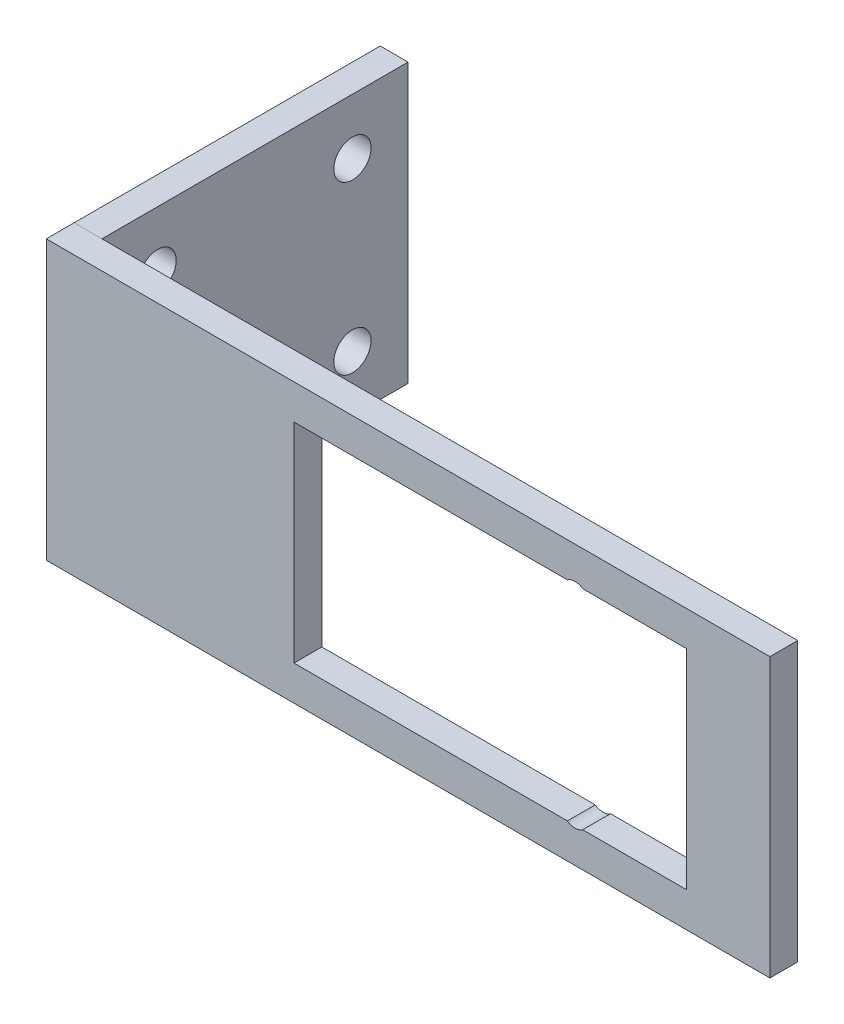
ISO-10303-21;
HEADER;
FILE_DESCRIPTION(('STEP AP214'),'2;1');
FILE_NAME('part.step','',(''),(''),'','','');
FILE_SCHEMA(('AUTOMOTIVE_DESIGN { 1 0 10303 214 1 1 1 1 }'));
ENDSEC;
DATA;
#1=APPLICATION_CONTEXT('core data for automotive mechanical design processes');
#2=APPLICATION_PROTOCOL_DEFINITION('international standard','automotive_design',2000,#1);
#3=PRODUCT_CONTEXT('',#1,'mechanical');
#4=PRODUCT('Part','Part','',(#3));
#5=PRODUCT_RELATED_PRODUCT_CATEGORY('part','',(#4));
#6=PRODUCT_DEFINITION_FORMATION('','',#4);
#7=PRODUCT_DEFINITION_CONTEXT('part definition',#1,'design');
#8=PRODUCT_DEFINITION('design','',#6,#7);
#9=PRODUCT_DEFINITION_SHAPE('','',#8);
#10=(LENGTH_UNIT() NAMED_UNIT(*) SI_UNIT(.MILLI.,.METRE.));
#11=(NAMED_UNIT(*) PLANE_ANGLE_UNIT() SI_UNIT($,.RADIAN.));
#12=(NAMED_UNIT(*) SI_UNIT($,.STERADIAN.) SOLID_ANGLE_UNIT());
#13=UNCERTAINTY_MEASURE_WITH_UNIT(LENGTH_MEASURE(1.E-05),#10,'distance_accuracy_value','');
#14=(GEOMETRIC_REPRESENTATION_CONTEXT(3) GLOBAL_UNCERTAINTY_ASSIGNED_CONTEXT((#13)) GLOBAL_UNIT_ASSIGNED_CONTEXT((#10,
#11,#12)) REPRESENTATION_CONTEXT('',''));
#15=CARTESIAN_POINT('',(0.,0.,0.));
#16=DIRECTION('',(0.,0.,1.));
#17=DIRECTION('',(1.,0.,0.));
#18=AXIS2_PLACEMENT_3D('',#15,#16,#17);
#19=CARTESIAN_POINT('',(0.,16.7363053790309,45.8468437795348));
#20=DIRECTION('',(0.,0.,-1.));
#21=DIRECTION('',(-1.,0.,0.));
#22=AXIS2_PLACEMENT_3D('',#19,#20,#21);
#23=PLANE('',#22);
#24=DIRECTION('',(-1.,0.,0.));
#25=VECTOR('',#24,1.);
#26=CARTESIAN_POINT('',(22.606,13.561305379031,45.8468437795348));
#27=LINE('',#26,#25);
#28=CARTESIAN_POINT('',(58.42,13.561305379031,45.8468437795348));
#29=VERTEX_POINT('',#28);
#30=CARTESIAN_POINT('',(48.9595534289816,13.561305379031,45.8468437795348));
#31=VERTEX_POINT('',#30);
#32=EDGE_CURVE('E142',#29,#31,#27,.T.);
#33=ORIENTED_EDGE('',*,*,#32,.T.);
#34=CARTESIAN_POINT('',(48.26,12.586305379031,45.8468437795348));
#35=DIRECTION('',(0.,0.,-1.));
#36=DIRECTION('',(-1.,0.,0.));
#37=AXIS2_PLACEMENT_3D('',#34,#35,#36);
#38=CIRCLE('',#37,1.19999999999999);
#39=CARTESIAN_POINT('',(47.5604465710184,13.561305379031,45.8468437795348));
#40=VERTEX_POINT('',#39);
#41=EDGE_CURVE('E181',#40,#31,#38,.T.);
#42=ORIENTED_EDGE('',*,*,#41,.F.);
#43=CARTESIAN_POINT('',(22.606,13.561305379031,45.8468437795348));
#44=VERTEX_POINT('',#43);
#45=EDGE_CURVE('E65',#40,#44,#27,.T.);
#46=ORIENTED_EDGE('',*,*,#45,.T.);
#47=DIRECTION('',(0.,-1.,0.));
#48=VECTOR('',#47,1.);
#49=CARTESIAN_POINT('',(22.606,13.561305379031,45.8468437795348));
#50=LINE('',#49,#48);
#51=CARTESIAN_POINT('',(22.606,-5.48869462096903,45.8468437795348));
#52=VERTEX_POINT('',#51);
#53=EDGE_CURVE('E136',#44,#52,#50,.T.);
#54=ORIENTED_EDGE('',*,*,#53,.T.);
#55=DIRECTION('',(1.,0.,0.));
#56=VECTOR('',#55,1.);
#57=CARTESIAN_POINT('',(22.606,-5.48869462096903,45.8468437795348));
#58=LINE('',#57,#56);
#59=CARTESIAN_POINT('',(47.5604465710184,-5.48869462096903,45.8468437795348));
#60=VERTEX_POINT('',#59);
#61=EDGE_CURVE('E145',#52,#60,#58,.T.);
#62=ORIENTED_EDGE('',*,*,#61,.T.);
#63=CARTESIAN_POINT('',(48.26,-4.51369462096903,45.8468437795348));
#64=DIRECTION('',(0.,0.,-1.));
#65=DIRECTION('',(-1.,0.,0.));
#66=AXIS2_PLACEMENT_3D('',#63,#64,#65);
#67=CIRCLE('',#66,1.19999999999999);
#68=CARTESIAN_POINT('',(48.9595534289816,-5.48869462096903,45.8468437795348));
#69=VERTEX_POINT('',#68);
#70=EDGE_CURVE('E187',#69,#60,#67,.T.);
#71=ORIENTED_EDGE('',*,*,#70,.F.);
#72=CARTESIAN_POINT('',(58.42,-5.48869462096903,45.8468437795348));
#73=VERTEX_POINT('',#72);
#74=EDGE_CURVE('E152',#69,#73,#58,.T.);
#75=ORIENTED_EDGE('',*,*,#74,.T.);
#76=DIRECTION('',(0.,1.,0.));
#77=VECTOR('',#76,1.);
#78=CARTESIAN_POINT('',(58.42,13.561305379031,45.8468437795348));
#79=LINE('',#78,#77);
#80=EDGE_CURVE('E151',#73,#29,#79,.T.);
#81=ORIENTED_EDGE('',*,*,#80,.T.);
#82=EDGE_LOOP('',(#33,#42,#46,#54,#62,#71,#75,#81));
#83=FACE_BOUND('',#82,.T.);
#84=DIRECTION('',(1.,0.,0.));
#85=VECTOR('',#84,1.);
#86=CARTESIAN_POINT('',(0.,16.7363053790309,45.8468437795348));
#87=LINE('',#86,#85);
#88=CARTESIAN_POINT('',(0.,16.7363053790309,45.8468437795348));
#89=VERTEX_POINT('',#88);
#90=CARTESIAN_POINT('',(66.04,16.7363053790309,45.8468437795348));
#91=VERTEX_POINT('',#90);
#92=EDGE_CURVE('E212',#89,#91,#87,.T.);
#93=ORIENTED_EDGE('',*,*,#92,.T.);
#94=DIRECTION('',(0.,1.,0.));
#95=VECTOR('',#94,1.);
#96=CARTESIAN_POINT('',(66.04,16.7363053790309,45.8468437795348));
#97=LINE('',#96,#95);
#98=CARTESIAN_POINT('',(66.04,-8.66369462096904,45.8468437795348));
#99=VERTEX_POINT('',#98);
#100=EDGE_CURVE('E188',#99,#91,#97,.T.);
#101=ORIENTED_EDGE('',*,*,#100,.F.);
#102=DIRECTION('',(1.,0.,0.));
#103=VECTOR('',#102,1.);
#104=CARTESIAN_POINT('',(0.,-8.66369462096904,45.8468437795348));
#105=LINE('',#104,#103);
#106=CARTESIAN_POINT('',(0.,-8.66369462096904,45.8468437795348));
#107=VERTEX_POINT('',#106);
#108=EDGE_CURVE('E213',#107,#99,#105,.T.);
#109=ORIENTED_EDGE('',*,*,#108,.F.);
#110=DIRECTION('',(0.,1.,0.));
#111=VECTOR('',#110,1.);
#112=CARTESIAN_POINT('',(0.,16.7363053790309,45.8468437795348));
#113=LINE('',#112,#111);
#114=EDGE_CURVE('E200',#107,#89,#113,.T.);
#115=ORIENTED_EDGE('',*,*,#114,.T.);
#116=EDGE_LOOP('',(#93,#101,#109,#115));
#117=FACE_BOUND('',#116,.T.);
#118=ADVANCED_FACE('F43',(#83,#117),#23,.T.);
#119=CARTESIAN_POINT('',(0.,-8.66369462096904,48.3868437795348));
#120=DIRECTION('',(0.,-1.,0.));
#121=DIRECTION('',(0.,0.,-1.));
#122=AXIS2_PLACEMENT_3D('',#119,#120,#121);
#123=PLANE('',#122);
#124=ORIENTED_EDGE('',*,*,#108,.T.);
#125=DIRECTION('',(0.,0.,-1.));
#126=VECTOR('',#125,1.);
#127=CARTESIAN_POINT('',(66.04,-8.66369462096904,48.3868437795348));
#128=LINE('',#127,#126);
#129=CARTESIAN_POINT('',(66.04,-8.66369462096904,48.3868437795348));
#130=VERTEX_POINT('',#129);
#131=EDGE_CURVE('E197',#130,#99,#128,.T.);
#132=ORIENTED_EDGE('',*,*,#131,.F.);
#133=DIRECTION('',(1.,0.,0.));
#134=VECTOR('',#133,1.);
#135=CARTESIAN_POINT('',(0.,-8.66369462096904,48.3868437795348));
#136=LINE('',#135,#134);
#137=CARTESIAN_POINT('',(0.,-8.66369462096904,48.3868437795348));
#138=VERTEX_POINT('',#137);
#139=EDGE_CURVE('E216',#138,#130,#136,.T.);
#140=ORIENTED_EDGE('',*,*,#139,.F.);
#141=DIRECTION('',(0.,0.,-1.));
#142=VECTOR('',#141,1.);
#143=CARTESIAN_POINT('',(0.,-8.66369462096904,48.3868437795348));
#144=LINE('',#143,#142);
#145=EDGE_CURVE('E209',#138,#107,#144,.T.);
#146=ORIENTED_EDGE('',*,*,#145,.T.);
#147=EDGE_LOOP('',(#124,#132,#140,#146));
#148=FACE_BOUND('',#147,.T.);
#149=ADVANCED_FACE('F255',(#148),#123,.T.);
#150=CARTESIAN_POINT('',(0.,16.7363053790309,48.3868437795348));
#151=DIRECTION('',(0.,0.,1.));
#152=DIRECTION('',(1.,0.,0.));
#153=AXIS2_PLACEMENT_3D('',#150,#151,#152);
#154=PLANE('',#153);
#155=DIRECTION('',(-1.,0.,0.));
#156=VECTOR('',#155,1.);
#157=CARTESIAN_POINT('',(22.606,13.561305379031,48.3868437795348));
#158=LINE('',#157,#156);
#159=CARTESIAN_POINT('',(47.5604465710184,13.561305379031,48.3868437795348));
#160=VERTEX_POINT('',#159);
#161=CARTESIAN_POINT('',(22.606,13.561305379031,48.3868437795348));
#162=VERTEX_POINT('',#161);
#163=EDGE_CURVE('E159',#160,#162,#158,.T.);
#164=ORIENTED_EDGE('',*,*,#163,.F.);
#165=CARTESIAN_POINT('',(48.26,12.586305379031,48.3868437795348));
#166=DIRECTION('',(0.,0.,1.));
#167=DIRECTION('',(1.,0.,0.));
#168=AXIS2_PLACEMENT_3D('',#165,#166,#167);
#169=CIRCLE('',#168,1.19999999999999);
#170=CARTESIAN_POINT('',(48.9595534289816,13.561305379031,48.3868437795348));
#171=VERTEX_POINT('',#170);
#172=EDGE_CURVE('E174',#171,#160,#169,.T.);
#173=ORIENTED_EDGE('',*,*,#172,.F.);
#174=CARTESIAN_POINT('',(58.42,13.561305379031,48.3868437795348));
#175=VERTEX_POINT('',#174);
#176=EDGE_CURVE('E57',#175,#171,#158,.T.);
#177=ORIENTED_EDGE('',*,*,#176,.F.);
#178=DIRECTION('',(0.,1.,0.));
#179=VECTOR('',#178,1.);
#180=CARTESIAN_POINT('',(58.42,13.561305379031,48.3868437795348));
#181=LINE('',#180,#179);
#182=CARTESIAN_POINT('',(58.42,-5.48869462096903,48.3868437795348));
#183=VERTEX_POINT('',#182);
#184=EDGE_CURVE('E169',#183,#175,#181,.T.);
#185=ORIENTED_EDGE('',*,*,#184,.F.);
#186=DIRECTION('',(1.,0.,0.));
#187=VECTOR('',#186,1.);
#188=CARTESIAN_POINT('',(22.606,-5.48869462096903,48.3868437795348));
#189=LINE('',#188,#187);
#190=CARTESIAN_POINT('',(48.9595534289816,-5.48869462096903,48.3868437795348));
#191=VERTEX_POINT('',#190);
#192=EDGE_CURVE('E166',#191,#183,#189,.T.);
#193=ORIENTED_EDGE('',*,*,#192,.F.);
#194=CARTESIAN_POINT('',(48.26,-4.51369462096903,48.3868437795348));
#195=DIRECTION('',(0.,0.,1.));
#196=DIRECTION('',(1.,0.,0.));
#197=AXIS2_PLACEMENT_3D('',#194,#195,#196);
#198=CIRCLE('',#197,1.19999999999999);
#199=CARTESIAN_POINT('',(47.5604465710184,-5.48869462096903,48.3868437795348));
#200=VERTEX_POINT('',#199);
#201=EDGE_CURVE('E184',#200,#191,#198,.T.);
#202=ORIENTED_EDGE('',*,*,#201,.F.);
#203=CARTESIAN_POINT('',(22.606,-5.48869462096903,48.3868437795348));
#204=VERTEX_POINT('',#203);
#205=EDGE_CURVE('E167',#204,#200,#189,.T.);
#206=ORIENTED_EDGE('',*,*,#205,.F.);
#207=DIRECTION('',(0.,-1.,0.));
#208=VECTOR('',#207,1.);
#209=CARTESIAN_POINT('',(22.606,13.561305379031,48.3868437795348));
#210=LINE('',#209,#208);
#211=EDGE_CURVE('E138',#162,#204,#210,.T.);
#212=ORIENTED_EDGE('',*,*,#211,.F.);
#213=EDGE_LOOP('',(#164,#173,#177,#185,#193,#202,#206,#212));
#214=FACE_BOUND('',#213,.T.);
#215=ORIENTED_EDGE('',*,*,#139,.T.);
#216=DIRECTION('',(0.,-1.,0.));
#217=VECTOR('',#216,1.);
#218=CARTESIAN_POINT('',(66.04,16.7363053790309,48.3868437795348));
#219=LINE('',#218,#217);
#220=CARTESIAN_POINT('',(66.04,16.7363053790309,48.3868437795348));
#221=VERTEX_POINT('',#220);
#222=EDGE_CURVE('E194',#221,#130,#219,.T.);
#223=ORIENTED_EDGE('',*,*,#222,.F.);
#224=DIRECTION('',(1.,0.,0.));
#225=VECTOR('',#224,1.);
#226=CARTESIAN_POINT('',(0.,16.7363053790309,48.3868437795348));
#227=LINE('',#226,#225);
#228=CARTESIAN_POINT('',(0.,16.7363053790309,48.3868437795348));
#229=VERTEX_POINT('',#228);
#230=EDGE_CURVE('E218',#229,#221,#227,.T.);
#231=ORIENTED_EDGE('',*,*,#230,.F.);
#232=DIRECTION('',(0.,-1.,0.));
#233=VECTOR('',#232,1.);
#234=CARTESIAN_POINT('',(0.,16.7363053790309,48.3868437795348));
#235=LINE('',#234,#233);
#236=EDGE_CURVE('E206',#229,#138,#235,.T.);
#237=ORIENTED_EDGE('',*,*,#236,.T.);
#238=EDGE_LOOP('',(#215,#223,#231,#237));
#239=FACE_BOUND('',#238,.T.);
#240=ADVANCED_FACE('F230',(#214,#239),#154,.T.);
#241=CARTESIAN_POINT('',(0.,16.7363053790309,45.8468437795348));
#242=DIRECTION('',(0.,1.,0.));
#243=DIRECTION('',(0.,0.,1.));
#244=AXIS2_PLACEMENT_3D('',#241,#242,#243);
#245=PLANE('',#244);
#246=ORIENTED_EDGE('',*,*,#230,.T.);
#247=DIRECTION('',(0.,0.,1.));
#248=VECTOR('',#247,1.);
#249=CARTESIAN_POINT('',(66.04,16.7363053790309,45.8468437795348));
#250=LINE('',#249,#248);
#251=EDGE_CURVE('E191',#91,#221,#250,.T.);
#252=ORIENTED_EDGE('',*,*,#251,.F.);
#253=ORIENTED_EDGE('',*,*,#92,.F.);
#254=DIRECTION('',(0.,0.,1.));
#255=VECTOR('',#254,1.);
#256=CARTESIAN_POINT('',(0.,16.7363053790309,45.8468437795348));
#257=LINE('',#256,#255);
#258=EDGE_CURVE('E203',#89,#229,#257,.T.);
#259=ORIENTED_EDGE('',*,*,#258,.T.);
#260=EDGE_LOOP('',(#246,#252,#253,#259));
#261=FACE_BOUND('',#260,.T.);
#262=ADVANCED_FACE('F264',(#261),#245,.T.);
#263=CARTESIAN_POINT('',(0.,0.,0.));
#264=DIRECTION('',(1.,0.,0.));
#265=DIRECTION('',(0.,0.,-1.));
#266=AXIS2_PLACEMENT_3D('',#263,#264,#265);
#267=PLANE('',#266);
#268=ORIENTED_EDGE('',*,*,#114,.F.);
#269=ORIENTED_EDGE('',*,*,#145,.F.);
#270=ORIENTED_EDGE('',*,*,#236,.F.);
#271=ORIENTED_EDGE('',*,*,#258,.F.);
#272=EDGE_LOOP('',(#268,#269,#270,#271));
#273=FACE_BOUND('',#272,.T.);
#274=ADVANCED_FACE('F267',(#273),#267,.F.);
#275=CARTESIAN_POINT('',(66.04,0.,0.));
#276=DIRECTION('',(1.,0.,0.));
#277=DIRECTION('',(0.,0.,-1.));
#278=AXIS2_PLACEMENT_3D('',#275,#276,#277);
#279=PLANE('',#278);
#280=ORIENTED_EDGE('',*,*,#100,.T.);
#281=ORIENTED_EDGE('',*,*,#251,.T.);
#282=ORIENTED_EDGE('',*,*,#222,.T.);
#283=ORIENTED_EDGE('',*,*,#131,.T.);
#284=EDGE_LOOP('',(#280,#281,#282,#283));
#285=FACE_BOUND('',#284,.T.);
#286=ADVANCED_FACE('F274',(#285),#279,.T.);
#287=CARTESIAN_POINT('',(48.26,-4.51369462096903,48.3868437795348));
#288=DIRECTION('',(0.,0.,1.));
#289=DIRECTION('',(1.,0.,0.));
#290=AXIS2_PLACEMENT_3D('',#287,#288,#289);
#291=CYLINDRICAL_SURFACE('',#290,1.19999999999999);
#292=ORIENTED_EDGE('',*,*,#201,.T.);
#293=DIRECTION('',(0.,0.,1.));
#294=VECTOR('',#293,1.);
#295=CARTESIAN_POINT('',(48.9595534289816,-5.48869462096903,48.3868437795348));
#296=LINE('',#295,#294);
#297=EDGE_CURVE('E12',#191,#69,#296,.F.);
#298=ORIENTED_EDGE('',*,*,#297,.T.);
#299=ORIENTED_EDGE('',*,*,#70,.T.);
#300=DIRECTION('',(0.,0.,1.));
#301=VECTOR('',#300,1.);
#302=CARTESIAN_POINT('',(47.5604465710184,-5.48869462096903,48.3868437795348));
#303=LINE('',#302,#301);
#304=EDGE_CURVE('E50',#60,#200,#303,.T.);
#305=ORIENTED_EDGE('',*,*,#304,.T.);
#306=EDGE_LOOP('',(#292,#298,#299,#305));
#307=FACE_BOUND('',#306,.T.);
#308=ADVANCED_FACE('F226',(#307),#291,.F.);
#309=CARTESIAN_POINT('',(48.26,12.586305379031,48.3868437795348));
#310=DIRECTION('',(0.,0.,1.));
#311=DIRECTION('',(1.,0.,0.));
#312=AXIS2_PLACEMENT_3D('',#309,#310,#311);
#313=CYLINDRICAL_SURFACE('',#312,1.19999999999999);
#314=ORIENTED_EDGE('',*,*,#172,.T.);
#315=DIRECTION('',(0.,0.,1.));
#316=VECTOR('',#315,1.);
#317=CARTESIAN_POINT('',(47.5604465710184,13.561305379031,48.3868437795348));
#318=LINE('',#317,#316);
#319=EDGE_CURVE('E223',#160,#40,#318,.F.);
#320=ORIENTED_EDGE('',*,*,#319,.T.);
#321=ORIENTED_EDGE('',*,*,#41,.T.);
#322=DIRECTION('',(0.,0.,1.));
#323=VECTOR('',#322,1.);
#324=CARTESIAN_POINT('',(48.9595534289816,13.561305379031,48.3868437795348));
#325=LINE('',#324,#323);
#326=EDGE_CURVE('E215',#31,#171,#325,.T.);
#327=ORIENTED_EDGE('',*,*,#326,.T.);
#328=EDGE_LOOP('',(#314,#320,#321,#327));
#329=FACE_BOUND('',#328,.T.);
#330=ADVANCED_FACE('F240',(#329),#313,.F.);
#331=CARTESIAN_POINT('',(22.606,13.561305379031,45.8468437795348));
#332=DIRECTION('',(0.,1.,0.));
#333=DIRECTION('',(0.,0.,1.));
#334=AXIS2_PLACEMENT_3D('',#331,#332,#333);
#335=PLANE('',#334);
#336=ORIENTED_EDGE('',*,*,#32,.F.);
#337=DIRECTION('',(0.,0.,1.));
#338=VECTOR('',#337,1.);
#339=CARTESIAN_POINT('',(58.42,13.561305379031,45.8468437795348));
#340=LINE('',#339,#338);
#341=EDGE_CURVE('E175',#29,#175,#340,.T.);
#342=ORIENTED_EDGE('',*,*,#341,.T.);
#343=ORIENTED_EDGE('',*,*,#176,.T.);
#344=ORIENTED_EDGE('',*,*,#326,.F.);
#345=EDGE_LOOP('',(#336,#342,#343,#344));
#346=FACE_BOUND('',#345,.T.);
#347=ADVANCED_FACE('F245',(#346),#335,.F.);
#348=CARTESIAN_POINT('',(22.606,-5.48869462096903,45.8468437795348));
#349=DIRECTION('',(0.,-1.,0.));
#350=DIRECTION('',(0.,0.,-1.));
#351=AXIS2_PLACEMENT_3D('',#348,#349,#350);
#352=PLANE('',#351);
#353=ORIENTED_EDGE('',*,*,#192,.T.);
#354=DIRECTION('',(0.,0.,1.));
#355=VECTOR('',#354,1.);
#356=CARTESIAN_POINT('',(58.42,-5.48869462096903,45.8468437795348));
#357=LINE('',#356,#355);
#358=EDGE_CURVE('E141',#73,#183,#357,.T.);
#359=ORIENTED_EDGE('',*,*,#358,.F.);
#360=ORIENTED_EDGE('',*,*,#74,.F.);
#361=ORIENTED_EDGE('',*,*,#297,.F.);
#362=EDGE_LOOP('',(#353,#359,#360,#361));
#363=FACE_BOUND('',#362,.T.);
#364=ADVANCED_FACE('F234',(#363),#352,.F.);
#365=CARTESIAN_POINT('',(58.42,13.561305379031,45.8468437795348));
#366=DIRECTION('',(1.,0.,0.));
#367=DIRECTION('',(0.,0.,-1.));
#368=AXIS2_PLACEMENT_3D('',#365,#366,#367);
#369=PLANE('',#368);
#370=ORIENTED_EDGE('',*,*,#184,.T.);
#371=ORIENTED_EDGE('',*,*,#341,.F.);
#372=ORIENTED_EDGE('',*,*,#80,.F.);
#373=ORIENTED_EDGE('',*,*,#358,.T.);
#374=EDGE_LOOP('',(#370,#371,#372,#373));
#375=FACE_BOUND('',#374,.T.);
#376=ADVANCED_FACE('F237',(#375),#369,.F.);
#377=ORIENTED_EDGE('',*,*,#61,.F.);
#378=DIRECTION('',(0.,0.,1.));
#379=VECTOR('',#378,1.);
#380=CARTESIAN_POINT('',(22.606,-5.48869462096903,45.8468437795348));
#381=LINE('',#380,#379);
#382=EDGE_CURVE('E131',#52,#204,#381,.T.);
#383=ORIENTED_EDGE('',*,*,#382,.T.);
#384=ORIENTED_EDGE('',*,*,#205,.T.);
#385=ORIENTED_EDGE('',*,*,#304,.F.);
#386=EDGE_LOOP('',(#377,#383,#384,#385));
#387=FACE_BOUND('',#386,.T.);
#388=ADVANCED_FACE('F146',(#387),#352,.F.);
#389=ORIENTED_EDGE('',*,*,#163,.T.);
#390=DIRECTION('',(0.,0.,1.));
#391=VECTOR('',#390,1.);
#392=CARTESIAN_POINT('',(22.606,13.561305379031,45.8468437795348));
#393=LINE('',#392,#391);
#394=EDGE_CURVE('E172',#44,#162,#393,.T.);
#395=ORIENTED_EDGE('',*,*,#394,.F.);
#396=ORIENTED_EDGE('',*,*,#45,.F.);
#397=ORIENTED_EDGE('',*,*,#319,.F.);
#398=EDGE_LOOP('',(#389,#395,#396,#397));
#399=FACE_BOUND('',#398,.T.);
#400=ADVANCED_FACE('F242',(#399),#335,.F.);
#401=CARTESIAN_POINT('',(22.606,13.561305379031,45.8468437795348));
#402=DIRECTION('',(-1.,0.,0.));
#403=DIRECTION('',(0.,0.,1.));
#404=AXIS2_PLACEMENT_3D('',#401,#402,#403);
#405=PLANE('',#404);
#406=ORIENTED_EDGE('',*,*,#211,.T.);
#407=ORIENTED_EDGE('',*,*,#382,.F.);
#408=ORIENTED_EDGE('',*,*,#53,.F.);
#409=ORIENTED_EDGE('',*,*,#394,.T.);
#410=EDGE_LOOP('',(#406,#407,#408,#409));
#411=FACE_BOUND('',#410,.T.);
#412=ADVANCED_FACE('F133',(#411),#405,.F.);
#413=CLOSED_SHELL('',(#118,#149,#240,#262,#274,#286,#308,#330,#347,#364,#376,#388,#400,#412));
#414=MANIFOLD_SOLID_BREP('B2',#413);
#415=CARTESIAN_POINT('',(2.54,-8.66369462096904,45.8468437795348));
#416=DIRECTION('',(0.,0.,-1.));
#417=DIRECTION('',(-1.,0.,0.));
#418=AXIS2_PLACEMENT_3D('',#415,#416,#417);
#419=PLANE('',#418);
#420=DIRECTION('',(0.,-1.,0.));
#421=VECTOR('',#420,1.);
#422=CARTESIAN_POINT('',(0.,-8.66369462096904,45.8468437795348));
#423=LINE('',#422,#421);
#424=CARTESIAN_POINT('',(0.,16.7363053790309,45.8468437795348));
#425=VERTEX_POINT('',#424);
#426=CARTESIAN_POINT('',(0.,-8.66369462096904,45.8468437795348));
#427=VERTEX_POINT('',#426);
#428=EDGE_CURVE('E434',#425,#427,#423,.T.);
#429=ORIENTED_EDGE('',*,*,#428,.T.);
#430=DIRECTION('',(-1.,0.,0.));
#431=VECTOR('',#430,1.);
#432=CARTESIAN_POINT('',(2.54,-8.66369462096904,45.8468437795348));
#433=LINE('',#432,#431);
#434=CARTESIAN_POINT('',(2.54,-8.66369462096904,45.8468437795348));
#435=VERTEX_POINT('',#434);
#436=EDGE_CURVE('E41',#435,#427,#433,.T.);
#437=ORIENTED_EDGE('',*,*,#436,.F.);
#438=DIRECTION('',(0.,-1.,0.));
#439=VECTOR('',#438,1.);
#440=CARTESIAN_POINT('',(2.54,-8.66369462096904,45.8468437795348));
#441=LINE('',#440,#439);
#442=CARTESIAN_POINT('',(2.54,16.7363053790309,45.8468437795348));
#443=VERTEX_POINT('',#442);
#444=EDGE_CURVE('E422',#443,#435,#441,.T.);
#445=ORIENTED_EDGE('',*,*,#444,.F.);
#446=DIRECTION('',(-1.,0.,0.));
#447=VECTOR('',#446,1.);
#448=CARTESIAN_POINT('',(2.54,16.7363053790309,45.8468437795348));
#449=LINE('',#448,#447);
#450=EDGE_CURVE('E430',#443,#425,#449,.T.);
#451=ORIENTED_EDGE('',*,*,#450,.T.);
#452=EDGE_LOOP('',(#429,#437,#445,#451));
#453=FACE_BOUND('',#452,.T.);
#454=ADVANCED_FACE('F371',(#453),#419,.F.);
#455=CARTESIAN_POINT('',(2.54,-8.66369462096904,45.8468437795348));
#456=DIRECTION('',(0.,1.,0.));
#457=DIRECTION('',(0.,0.,1.));
#458=AXIS2_PLACEMENT_3D('',#455,#456,#457);
#459=PLANE('',#458);
#460=DIRECTION('',(0.,0.,-1.));
#461=VECTOR('',#460,1.);
#462=CARTESIAN_POINT('',(0.,-8.66369462096904,45.8468437795348));
#463=LINE('',#462,#461);
#464=CARTESIAN_POINT('',(0.,-8.66369462096904,17.9068437795348));
#465=VERTEX_POINT('',#464);
#466=EDGE_CURVE('E426',#427,#465,#463,.T.);
#467=ORIENTED_EDGE('',*,*,#466,.T.);
#468=DIRECTION('',(-1.,0.,0.));
#469=VECTOR('',#468,1.);
#470=CARTESIAN_POINT('',(2.54,-8.66369462096904,17.9068437795348));
#471=LINE('',#470,#469);
#472=CARTESIAN_POINT('',(2.54,-8.66369462096904,17.9068437795348));
#473=VERTEX_POINT('',#472);
#474=EDGE_CURVE('E379',#473,#465,#471,.T.);
#475=ORIENTED_EDGE('',*,*,#474,.F.);
#476=DIRECTION('',(0.,0.,-1.));
#477=VECTOR('',#476,1.);
#478=CARTESIAN_POINT('',(2.54,-8.66369462096904,45.8468437795348));
#479=LINE('',#478,#477);
#480=EDGE_CURVE('E417',#435,#473,#479,.T.);
#481=ORIENTED_EDGE('',*,*,#480,.F.);
#482=ORIENTED_EDGE('',*,*,#436,.T.);
#483=EDGE_LOOP('',(#467,#475,#481,#482));
#484=FACE_BOUND('',#483,.T.);
#485=ADVANCED_FACE('F425',(#484),#459,.F.);
#486=CARTESIAN_POINT('',(2.54,-8.66369462096904,17.9068437795348));
#487=DIRECTION('',(0.,0.,1.));
#488=DIRECTION('',(1.,0.,0.));
#489=AXIS2_PLACEMENT_3D('',#486,#487,#488);
#490=PLANE('',#489);
#491=DIRECTION('',(0.,1.,0.));
#492=VECTOR('',#491,1.);
#493=CARTESIAN_POINT('',(0.,-8.66369462096904,17.9068437795348));
#494=LINE('',#493,#492);
#495=CARTESIAN_POINT('',(0.,16.7363053790309,17.9068437795348));
#496=VERTEX_POINT('',#495);
#497=EDGE_CURVE('E404',#465,#496,#494,.T.);
#498=ORIENTED_EDGE('',*,*,#497,.T.);
#499=DIRECTION('',(-1.,0.,0.));
#500=VECTOR('',#499,1.);
#501=CARTESIAN_POINT('',(2.54,16.7363053790309,17.9068437795348));
#502=LINE('',#501,#500);
#503=CARTESIAN_POINT('',(2.54,16.7363053790309,17.9068437795348));
#504=VERTEX_POINT('',#503);
#505=EDGE_CURVE('E427',#504,#496,#502,.T.);
#506=ORIENTED_EDGE('',*,*,#505,.F.);
#507=DIRECTION('',(0.,1.,0.));
#508=VECTOR('',#507,1.);
#509=CARTESIAN_POINT('',(2.54,-8.66369462096904,17.9068437795348));
#510=LINE('',#509,#508);
#511=EDGE_CURVE('E420',#473,#504,#510,.T.);
#512=ORIENTED_EDGE('',*,*,#511,.F.);
#513=ORIENTED_EDGE('',*,*,#474,.T.);
#514=EDGE_LOOP('',(#498,#506,#512,#513));
#515=FACE_BOUND('',#514,.T.);
#516=ADVANCED_FACE('F428',(#515),#490,.F.);
#517=CARTESIAN_POINT('',(2.54,16.7363053790309,45.8468437795348));
#518=DIRECTION('',(0.,-1.,0.));
#519=DIRECTION('',(0.,0.,-1.));
#520=AXIS2_PLACEMENT_3D('',#517,#518,#519);
#521=PLANE('',#520);
#522=DIRECTION('',(0.,0.,1.));
#523=VECTOR('',#522,1.);
#524=CARTESIAN_POINT('',(0.,16.7363053790309,45.8468437795348));
#525=LINE('',#524,#523);
#526=EDGE_CURVE('E410',#496,#425,#525,.T.);
#527=ORIENTED_EDGE('',*,*,#526,.T.);
#528=ORIENTED_EDGE('',*,*,#450,.F.);
#529=DIRECTION('',(0.,0.,1.));
#530=VECTOR('',#529,1.);
#531=CARTESIAN_POINT('',(2.54,16.7363053790309,45.8468437795348));
#532=LINE('',#531,#530);
#533=EDGE_CURVE('E387',#504,#443,#532,.T.);
#534=ORIENTED_EDGE('',*,*,#533,.F.);
#535=ORIENTED_EDGE('',*,*,#505,.T.);
#536=EDGE_LOOP('',(#527,#528,#534,#535));
#537=FACE_BOUND('',#536,.T.);
#538=ADVANCED_FACE('F442',(#537),#521,.F.);
#539=CARTESIAN_POINT('',(2.54,0.,0.));
#540=DIRECTION('',(-1.,0.,0.));
#541=DIRECTION('',(0.,0.,1.));
#542=AXIS2_PLACEMENT_3D('',#539,#540,#541);
#543=PLANE('',#542);
#544=CARTESIAN_POINT('',(2.54,11.656305379031,40.7668437795348));
#545=DIRECTION('',(1.,0.,0.));
#546=DIRECTION('',(0.,0.,-1.));
#547=AXIS2_PLACEMENT_3D('',#544,#545,#546);
#548=CIRCLE('',#547,1.69999999999999);
#549=CARTESIAN_POINT('',(2.54,11.656305379031,39.0668437795348));
#550=VERTEX_POINT('',#549);
#551=EDGE_CURVE('E468',#550,#550,#548,.T.);
#552=ORIENTED_EDGE('',*,*,#551,.F.);
#553=EDGE_LOOP('',(#552));
#554=FACE_BOUND('',#553,.T.);
#555=CARTESIAN_POINT('',(2.54,11.656305379031,22.9868437795348));
#556=DIRECTION('',(1.,0.,0.));
#557=DIRECTION('',(0.,0.,-1.));
#558=AXIS2_PLACEMENT_3D('',#555,#556,#557);
#559=CIRCLE('',#558,1.69999999999999);
#560=CARTESIAN_POINT('',(2.54,11.656305379031,21.2868437795348));
#561=VERTEX_POINT('',#560);
#562=EDGE_CURVE('E462',#561,#561,#559,.T.);
#563=ORIENTED_EDGE('',*,*,#562,.F.);
#564=EDGE_LOOP('',(#563));
#565=FACE_BOUND('',#564,.T.);
#566=CARTESIAN_POINT('',(2.54,-3.58369462096905,22.9868437795348));
#567=DIRECTION('',(1.,0.,0.));
#568=DIRECTION('',(0.,0.,-1.));
#569=AXIS2_PLACEMENT_3D('',#566,#567,#568);
#570=CIRCLE('',#569,1.69999999999999);
#571=CARTESIAN_POINT('',(2.54,-3.58369462096905,21.2868437795348));
#572=VERTEX_POINT('',#571);
#573=EDGE_CURVE('E456',#572,#572,#570,.T.);
#574=ORIENTED_EDGE('',*,*,#573,.F.);
#575=EDGE_LOOP('',(#574));
#576=FACE_BOUND('',#575,.T.);
#577=CARTESIAN_POINT('',(2.54,-3.58369462096905,40.7668437795348));
#578=DIRECTION('',(1.,0.,0.));
#579=DIRECTION('',(0.,0.,-1.));
#580=AXIS2_PLACEMENT_3D('',#577,#578,#579);
#581=CIRCLE('',#580,1.69999999999999);
#582=CARTESIAN_POINT('',(2.54,-3.58369462096905,39.0668437795348));
#583=VERTEX_POINT('',#582);
#584=EDGE_CURVE('E450',#583,#583,#581,.T.);
#585=ORIENTED_EDGE('',*,*,#584,.F.);
#586=EDGE_LOOP('',(#585));
#587=FACE_BOUND('',#586,.T.);
#588=ORIENTED_EDGE('',*,*,#444,.T.);
#589=ORIENTED_EDGE('',*,*,#480,.T.);
#590=ORIENTED_EDGE('',*,*,#511,.T.);
#591=ORIENTED_EDGE('',*,*,#533,.T.);
#592=EDGE_LOOP('',(#588,#589,#590,#591));
#593=FACE_BOUND('',#592,.T.);
#594=ADVANCED_FACE('F418',(#554,#565,#576,#587,#593),#543,.F.);
#595=CARTESIAN_POINT('',(0.,0.,0.));
#596=DIRECTION('',(-1.,0.,0.));
#597=DIRECTION('',(0.,0.,1.));
#598=AXIS2_PLACEMENT_3D('',#595,#596,#597);
#599=PLANE('',#598);
#600=CARTESIAN_POINT('',(0.,11.656305379031,40.7668437795348));
#601=DIRECTION('',(1.,0.,0.));
#602=DIRECTION('',(0.,0.,-1.));
#603=AXIS2_PLACEMENT_3D('',#600,#601,#602);
#604=CIRCLE('',#603,1.69999999999999);
#605=CARTESIAN_POINT('',(0.,11.656305379031,39.0668437795348));
#606=VERTEX_POINT('',#605);
#607=EDGE_CURVE('E465',#606,#606,#604,.T.);
#608=ORIENTED_EDGE('',*,*,#607,.T.);
#609=EDGE_LOOP('',(#608));
#610=FACE_BOUND('',#609,.T.);
#611=CARTESIAN_POINT('',(0.,11.656305379031,22.9868437795348));
#612=DIRECTION('',(1.,0.,0.));
#613=DIRECTION('',(0.,0.,-1.));
#614=AXIS2_PLACEMENT_3D('',#611,#612,#613);
#615=CIRCLE('',#614,1.69999999999999);
#616=CARTESIAN_POINT('',(0.,11.656305379031,21.2868437795348));
#617=VERTEX_POINT('',#616);
#618=EDGE_CURVE('E459',#617,#617,#615,.T.);
#619=ORIENTED_EDGE('',*,*,#618,.T.);
#620=EDGE_LOOP('',(#619));
#621=FACE_BOUND('',#620,.T.);
#622=CARTESIAN_POINT('',(0.,-3.58369462096905,22.9868437795348));
#623=DIRECTION('',(1.,0.,0.));
#624=DIRECTION('',(0.,0.,-1.));
#625=AXIS2_PLACEMENT_3D('',#622,#623,#624);
#626=CIRCLE('',#625,1.69999999999999);
#627=CARTESIAN_POINT('',(0.,-3.58369462096905,21.2868437795348));
#628=VERTEX_POINT('',#627);
#629=EDGE_CURVE('E453',#628,#628,#626,.T.);
#630=ORIENTED_EDGE('',*,*,#629,.T.);
#631=EDGE_LOOP('',(#630));
#632=FACE_BOUND('',#631,.T.);
#633=CARTESIAN_POINT('',(0.,-3.58369462096905,40.7668437795348));
#634=DIRECTION('',(1.,0.,0.));
#635=DIRECTION('',(0.,0.,-1.));
#636=AXIS2_PLACEMENT_3D('',#633,#634,#635);
#637=CIRCLE('',#636,1.69999999999999);
#638=CARTESIAN_POINT('',(0.,-3.58369462096905,39.0668437795348));
#639=VERTEX_POINT('',#638);
#640=EDGE_CURVE('E437',#639,#639,#637,.T.);
#641=ORIENTED_EDGE('',*,*,#640,.T.);
#642=EDGE_LOOP('',(#641));
#643=FACE_BOUND('',#642,.T.);
#644=ORIENTED_EDGE('',*,*,#428,.F.);
#645=ORIENTED_EDGE('',*,*,#526,.F.);
#646=ORIENTED_EDGE('',*,*,#497,.F.);
#647=ORIENTED_EDGE('',*,*,#466,.F.);
#648=EDGE_LOOP('',(#644,#645,#646,#647));
#649=FACE_BOUND('',#648,.T.);
#650=ADVANCED_FACE('F445',(#610,#621,#632,#643,#649),#599,.T.);
#651=CARTESIAN_POINT('',(2.54,-3.58369462096905,40.7668437795348));
#652=DIRECTION('',(1.,0.,0.));
#653=DIRECTION('',(0.,0.,-1.));
#654=AXIS2_PLACEMENT_3D('',#651,#652,#653);
#655=CYLINDRICAL_SURFACE('',#654,1.69999999999999);
#656=ORIENTED_EDGE('',*,*,#640,.F.);
#657=EDGE_LOOP('',(#656));
#658=FACE_BOUND('',#657,.T.);
#659=ORIENTED_EDGE('',*,*,#584,.T.);
#660=EDGE_LOOP('',(#659));
#661=FACE_BOUND('',#660,.T.);
#662=ADVANCED_FACE('F483',(#658,#661),#655,.F.);
#663=CARTESIAN_POINT('',(2.54,-3.58369462096905,22.9868437795348));
#664=DIRECTION('',(1.,0.,0.));
#665=DIRECTION('',(0.,0.,-1.));
#666=AXIS2_PLACEMENT_3D('',#663,#664,#665);
#667=CYLINDRICAL_SURFACE('',#666,1.69999999999999);
#668=ORIENTED_EDGE('',*,*,#629,.F.);
#669=EDGE_LOOP('',(#668));
#670=FACE_BOUND('',#669,.T.);
#671=ORIENTED_EDGE('',*,*,#573,.T.);
#672=EDGE_LOOP('',(#671));
#673=FACE_BOUND('',#672,.T.);
#674=ADVANCED_FACE('F485',(#670,#673),#667,.F.);
#675=CARTESIAN_POINT('',(2.54,11.656305379031,22.9868437795348));
#676=DIRECTION('',(1.,0.,0.));
#677=DIRECTION('',(0.,0.,-1.));
#678=AXIS2_PLACEMENT_3D('',#675,#676,#677);
#679=CYLINDRICAL_SURFACE('',#678,1.69999999999999);
#680=ORIENTED_EDGE('',*,*,#618,.F.);
#681=EDGE_LOOP('',(#680));
#682=FACE_BOUND('',#681,.T.);
#683=ORIENTED_EDGE('',*,*,#562,.T.);
#684=EDGE_LOOP('',(#683));
#685=FACE_BOUND('',#684,.T.);
#686=ADVANCED_FACE('F492',(#682,#685),#679,.F.);
#687=CARTESIAN_POINT('',(2.54,11.656305379031,40.7668437795348));
#688=DIRECTION('',(1.,0.,0.));
#689=DIRECTION('',(0.,0.,-1.));
#690=AXIS2_PLACEMENT_3D('',#687,#688,#689);
#691=CYLINDRICAL_SURFACE('',#690,1.69999999999999);
#692=ORIENTED_EDGE('',*,*,#607,.F.);
#693=EDGE_LOOP('',(#692));
#694=FACE_BOUND('',#693,.T.);
#695=ORIENTED_EDGE('',*,*,#551,.T.);
#696=EDGE_LOOP('',(#695));
#697=FACE_BOUND('',#696,.T.);
#698=ADVANCED_FACE('F472',(#694,#697),#691,.F.);
#699=CLOSED_SHELL('',(#454,#485,#516,#538,#594,#650,#662,#674,#686,#698));
#700=MANIFOLD_SOLID_BREP('B6',#699);
#701=ADVANCED_BREP_SHAPE_REPRESENTATION('',(#18,#414,#700),#14);
#702=SHAPE_DEFINITION_REPRESENTATION(#9,#701);
ENDSEC;
END-ISO-10303-21;
